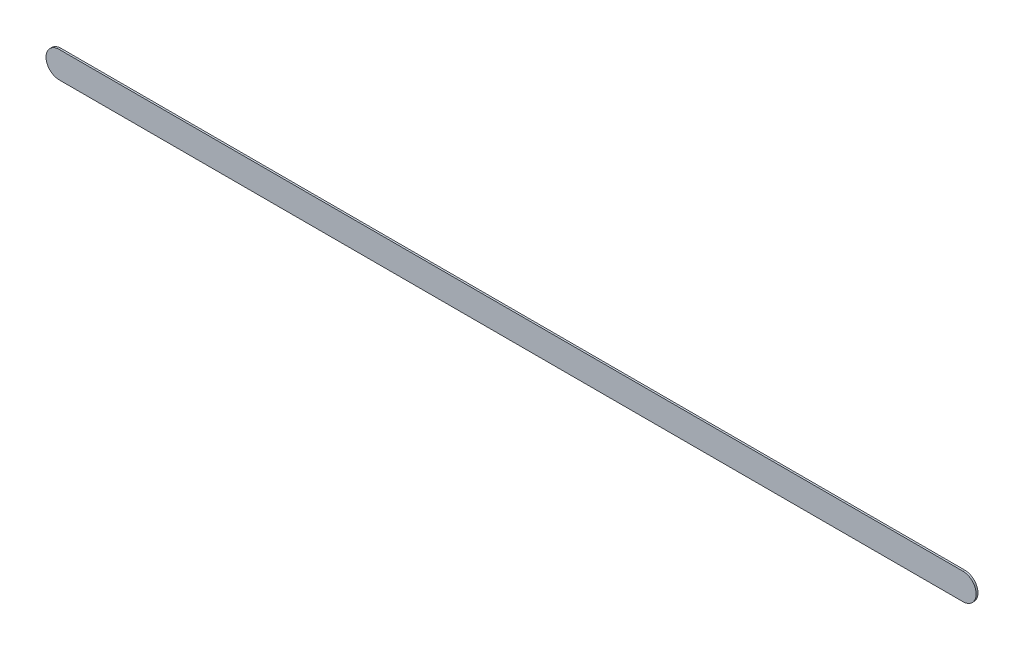
ISO-10303-21;
HEADER;
FILE_DESCRIPTION(('STEP AP214'),'2;1');
FILE_NAME('part.step','',(''),(''),'','','');
FILE_SCHEMA(('AUTOMOTIVE_DESIGN { 1 0 10303 214 1 1 1 1 }'));
ENDSEC;
DATA;
#1=APPLICATION_CONTEXT('core data for automotive mechanical design processes');
#2=APPLICATION_PROTOCOL_DEFINITION('international standard','automotive_design',2000,#1);
#3=PRODUCT_CONTEXT('',#1,'mechanical');
#4=PRODUCT('Part','Part','',(#3));
#5=PRODUCT_RELATED_PRODUCT_CATEGORY('part','',(#4));
#6=PRODUCT_DEFINITION_FORMATION('','',#4);
#7=PRODUCT_DEFINITION_CONTEXT('part definition',#1,'design');
#8=PRODUCT_DEFINITION('design','',#6,#7);
#9=PRODUCT_DEFINITION_SHAPE('','',#8);
#10=(LENGTH_UNIT() NAMED_UNIT(*) SI_UNIT(.MILLI.,.METRE.));
#11=(NAMED_UNIT(*) PLANE_ANGLE_UNIT() SI_UNIT($,.RADIAN.));
#12=(NAMED_UNIT(*) SI_UNIT($,.STERADIAN.) SOLID_ANGLE_UNIT());
#13=UNCERTAINTY_MEASURE_WITH_UNIT(LENGTH_MEASURE(1.E-05),#10,'distance_accuracy_value','');
#14=(GEOMETRIC_REPRESENTATION_CONTEXT(3) GLOBAL_UNCERTAINTY_ASSIGNED_CONTEXT((#13)) GLOBAL_UNIT_ASSIGNED_CONTEXT((#10,
#11,#12)) REPRESENTATION_CONTEXT('',''));
#15=CARTESIAN_POINT('',(0.,0.,0.));
#16=DIRECTION('',(0.,0.,1.));
#17=DIRECTION('',(1.,0.,0.));
#18=AXIS2_PLACEMENT_3D('',#15,#16,#17);
#19=CARTESIAN_POINT('',(75.8695968,84.1796005,0.));
#20=DIRECTION('',(0.,1.,0.));
#21=DIRECTION('',(1.,0.,0.));
#22=AXIS2_PLACEMENT_3D('',#19,#20,#21);
#23=PLANE('',#22);
#24=DIRECTION('',(1.,0.,0.));
#25=VECTOR('',#24,1.);
#26=CARTESIAN_POINT('',(75.8695968,84.1796005,0.03556));
#27=LINE('',#26,#25);
#28=CARTESIAN_POINT('',(75.8695968,84.1796005,0.03556));
#29=VERTEX_POINT('',#28);
#30=CARTESIAN_POINT('',(92.9704008,84.1796005,0.03556));
#31=VERTEX_POINT('',#30);
#32=EDGE_CURVE('E11',#29,#31,#27,.T.);
#33=ORIENTED_EDGE('',*,*,#32,.F.);
#34=DIRECTION('',(0.,0.,1.));
#35=VECTOR('',#34,1.);
#36=CARTESIAN_POINT('',(75.8695968,84.1796005,0.));
#37=LINE('',#36,#35);
#38=CARTESIAN_POINT('',(75.8695968,84.1796005,0.));
#39=VERTEX_POINT('',#38);
#40=EDGE_CURVE('E24',#39,#29,#37,.T.);
#41=ORIENTED_EDGE('',*,*,#40,.F.);
#42=DIRECTION('',(1.,0.,0.));
#43=VECTOR('',#42,1.);
#44=CARTESIAN_POINT('',(75.8695968,84.1796005,0.));
#45=LINE('',#44,#43);
#46=CARTESIAN_POINT('',(92.9704008,84.1796005,0.));
#47=VERTEX_POINT('',#46);
#48=EDGE_CURVE('E75',#39,#47,#45,.T.);
#49=ORIENTED_EDGE('',*,*,#48,.T.);
#50=DIRECTION('',(0.,0.,1.));
#51=VECTOR('',#50,1.);
#52=CARTESIAN_POINT('',(92.9704008,84.1796005,0.));
#53=LINE('',#52,#51);
#54=EDGE_CURVE('E37',#47,#31,#53,.T.);
#55=ORIENTED_EDGE('',*,*,#54,.T.);
#56=EDGE_LOOP('',(#33,#41,#49,#55));
#57=FACE_BOUND('',#56,.T.);
#58=ADVANCED_FACE('F17',(#57),#23,.F.);
#59=CARTESIAN_POINT('',(92.9704008,84.4296,0.));
#60=DIRECTION('',(0.,0.,-1.));
#61=DIRECTION('',(0.,-1.,0.));
#62=AXIS2_PLACEMENT_3D('',#59,#60,#61);
#63=CYLINDRICAL_SURFACE('',#62,0.249999499999997);
#64=CARTESIAN_POINT('',(92.9704008,84.4296,0.03556));
#65=DIRECTION('',(0.,0.,1.));
#66=DIRECTION('',(0.,-1.,0.));
#67=AXIS2_PLACEMENT_3D('',#64,#65,#66);
#68=CIRCLE('',#67,0.249999499999997);
#69=CARTESIAN_POINT('',(92.9704008,84.6795995,0.03556));
#70=VERTEX_POINT('',#69);
#71=EDGE_CURVE('E83',#31,#70,#68,.T.);
#72=ORIENTED_EDGE('',*,*,#71,.F.);
#73=ORIENTED_EDGE('',*,*,#54,.F.);
#74=CARTESIAN_POINT('',(92.9704008,84.4296,0.));
#75=DIRECTION('',(0.,0.,1.));
#76=DIRECTION('',(0.,-1.,0.));
#77=AXIS2_PLACEMENT_3D('',#74,#75,#76);
#78=CIRCLE('',#77,0.249999499999997);
#79=CARTESIAN_POINT('',(92.9704008,84.6795995,0.));
#80=VERTEX_POINT('',#79);
#81=EDGE_CURVE('E81',#47,#80,#78,.T.);
#82=ORIENTED_EDGE('',*,*,#81,.T.);
#83=DIRECTION('',(0.,0.,1.));
#84=VECTOR('',#83,1.);
#85=CARTESIAN_POINT('',(92.9704008,84.6795995,0.));
#86=LINE('',#85,#84);
#87=EDGE_CURVE('E67',#80,#70,#86,.T.);
#88=ORIENTED_EDGE('',*,*,#87,.T.);
#89=EDGE_LOOP('',(#72,#73,#82,#88));
#90=FACE_BOUND('',#89,.T.);
#91=ADVANCED_FACE('F89',(#90),#63,.T.);
#92=CARTESIAN_POINT('',(92.9704008,84.6795995,0.));
#93=DIRECTION('',(0.,-1.,0.));
#94=DIRECTION('',(-1.,0.,0.));
#95=AXIS2_PLACEMENT_3D('',#92,#93,#94);
#96=PLANE('',#95);
#97=DIRECTION('',(-1.,0.,0.));
#98=VECTOR('',#97,1.);
#99=CARTESIAN_POINT('',(92.9704008,84.6795995,0.03556));
#100=LINE('',#99,#98);
#101=CARTESIAN_POINT('',(75.8695968,84.6795995,0.03556));
#102=VERTEX_POINT('',#101);
#103=EDGE_CURVE('E71',#70,#102,#100,.T.);
#104=ORIENTED_EDGE('',*,*,#103,.F.);
#105=ORIENTED_EDGE('',*,*,#87,.F.);
#106=DIRECTION('',(-1.,0.,0.));
#107=VECTOR('',#106,1.);
#108=CARTESIAN_POINT('',(92.9704008,84.6795995,0.));
#109=LINE('',#108,#107);
#110=CARTESIAN_POINT('',(75.8695968,84.6795995,0.));
#111=VERTEX_POINT('',#110);
#112=EDGE_CURVE('E63',#80,#111,#109,.T.);
#113=ORIENTED_EDGE('',*,*,#112,.T.);
#114=DIRECTION('',(0.,0.,1.));
#115=VECTOR('',#114,1.);
#116=CARTESIAN_POINT('',(75.8695968,84.6795995,0.));
#117=LINE('',#116,#115);
#118=EDGE_CURVE('E53',#111,#102,#117,.T.);
#119=ORIENTED_EDGE('',*,*,#118,.T.);
#120=EDGE_LOOP('',(#104,#105,#113,#119));
#121=FACE_BOUND('',#120,.T.);
#122=ADVANCED_FACE('F66',(#121),#96,.F.);
#123=CARTESIAN_POINT('',(75.8695968,84.4296,0.));
#124=DIRECTION('',(0.,0.,-1.));
#125=DIRECTION('',(0.,1.,0.));
#126=AXIS2_PLACEMENT_3D('',#123,#124,#125);
#127=CYLINDRICAL_SURFACE('',#126,0.249999499999997);
#128=CARTESIAN_POINT('',(75.8695968,84.4296,0.03556));
#129=DIRECTION('',(0.,0.,1.));
#130=DIRECTION('',(0.,1.,0.));
#131=AXIS2_PLACEMENT_3D('',#128,#129,#130);
#132=CIRCLE('',#131,0.249999499999997);
#133=EDGE_CURVE('E59',#102,#29,#132,.T.);
#134=ORIENTED_EDGE('',*,*,#133,.F.);
#135=ORIENTED_EDGE('',*,*,#118,.F.);
#136=CARTESIAN_POINT('',(75.8695968,84.4296,0.));
#137=DIRECTION('',(0.,0.,1.));
#138=DIRECTION('',(0.,1.,0.));
#139=AXIS2_PLACEMENT_3D('',#136,#137,#138);
#140=CIRCLE('',#139,0.249999499999997);
#141=EDGE_CURVE('E57',#111,#39,#140,.T.);
#142=ORIENTED_EDGE('',*,*,#141,.T.);
#143=ORIENTED_EDGE('',*,*,#40,.T.);
#144=EDGE_LOOP('',(#134,#135,#142,#143));
#145=FACE_BOUND('',#144,.T.);
#146=ADVANCED_FACE('F55',(#145),#127,.T.);
#147=CARTESIAN_POINT('',(75.8695968,84.1796005,0.));
#148=DIRECTION('',(0.,0.,-1.));
#149=DIRECTION('',(-1.,0.,0.));
#150=AXIS2_PLACEMENT_3D('',#147,#148,#149);
#151=PLANE('',#150);
#152=ORIENTED_EDGE('',*,*,#141,.F.);
#153=ORIENTED_EDGE('',*,*,#112,.F.);
#154=ORIENTED_EDGE('',*,*,#81,.F.);
#155=ORIENTED_EDGE('',*,*,#48,.F.);
#156=EDGE_LOOP('',(#152,#153,#154,#155));
#157=FACE_BOUND('',#156,.T.);
#158=ADVANCED_FACE('F74',(#157),#151,.T.);
#159=CARTESIAN_POINT('',(75.8695968,84.1796005,0.03556));
#160=DIRECTION('',(0.,0.,-1.));
#161=DIRECTION('',(-1.,0.,0.));
#162=AXIS2_PLACEMENT_3D('',#159,#160,#161);
#163=PLANE('',#162);
#164=ORIENTED_EDGE('',*,*,#32,.T.);
#165=ORIENTED_EDGE('',*,*,#71,.T.);
#166=ORIENTED_EDGE('',*,*,#103,.T.);
#167=ORIENTED_EDGE('',*,*,#133,.T.);
#168=EDGE_LOOP('',(#164,#165,#166,#167));
#169=FACE_BOUND('',#168,.T.);
#170=ADVANCED_FACE('F91',(#169),#163,.F.);
#171=CLOSED_SHELL('',(#58,#91,#122,#146,#158,#170));
#172=MANIFOLD_SOLID_BREP('B1',#171);
#173=ADVANCED_BREP_SHAPE_REPRESENTATION('',(#18,#172),#14);
#174=SHAPE_DEFINITION_REPRESENTATION(#9,#173);
ENDSEC;
END-ISO-10303-21;
